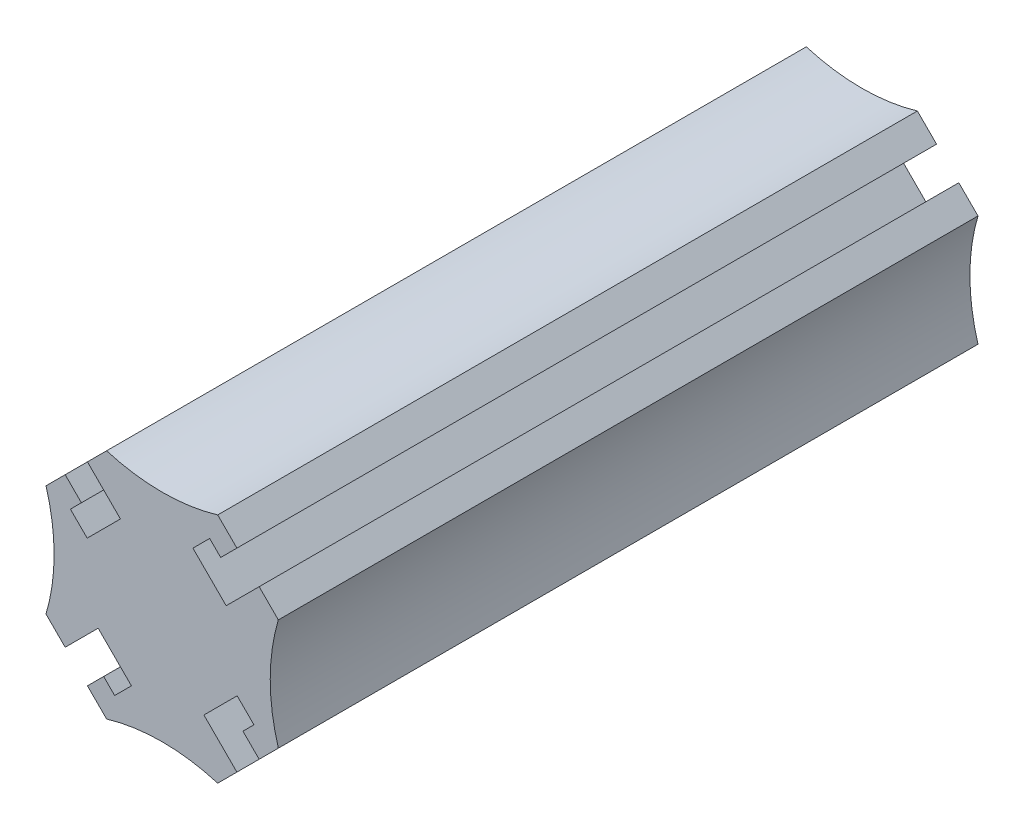
ISO-10303-21;
HEADER;
FILE_DESCRIPTION(('STEP AP214'),'2;1');
FILE_NAME('part.step','',(''),(''),'','','');
FILE_SCHEMA(('AUTOMOTIVE_DESIGN { 1 0 10303 214 1 1 1 1 }'));
ENDSEC;
DATA;
#1=APPLICATION_CONTEXT('core data for automotive mechanical design processes');
#2=APPLICATION_PROTOCOL_DEFINITION('international standard','automotive_design',2000,#1);
#3=PRODUCT_CONTEXT('',#1,'mechanical');
#4=PRODUCT('Part','Part','',(#3));
#5=PRODUCT_RELATED_PRODUCT_CATEGORY('part','',(#4));
#6=PRODUCT_DEFINITION_FORMATION('','',#4);
#7=PRODUCT_DEFINITION_CONTEXT('part definition',#1,'design');
#8=PRODUCT_DEFINITION('design','',#6,#7);
#9=PRODUCT_DEFINITION_SHAPE('','',#8);
#10=(LENGTH_UNIT() NAMED_UNIT(*) SI_UNIT(.MILLI.,.METRE.));
#11=(NAMED_UNIT(*) PLANE_ANGLE_UNIT() SI_UNIT($,.RADIAN.));
#12=(NAMED_UNIT(*) SI_UNIT($,.STERADIAN.) SOLID_ANGLE_UNIT());
#13=UNCERTAINTY_MEASURE_WITH_UNIT(LENGTH_MEASURE(1.E-05),#10,'distance_accuracy_value','');
#14=(GEOMETRIC_REPRESENTATION_CONTEXT(3) GLOBAL_UNCERTAINTY_ASSIGNED_CONTEXT((#13)) GLOBAL_UNIT_ASSIGNED_CONTEXT((#10,
#11,#12)) REPRESENTATION_CONTEXT('',''));
#15=CARTESIAN_POINT('',(0.,0.,0.));
#16=DIRECTION('',(0.,0.,1.));
#17=DIRECTION('',(1.,0.,0.));
#18=AXIS2_PLACEMENT_3D('',#15,#16,#17);
#19=CARTESIAN_POINT('',(0.,77.8,-180.));
#20=DIRECTION('',(0.,0.,1.));
#21=DIRECTION('',(1.,0.,0.));
#22=AXIS2_PLACEMENT_3D('',#19,#20,#21);
#23=CYLINDRICAL_SURFACE('',#22,50.);
#24=DIRECTION('',(0.,0.,1.));
#25=VECTOR('',#24,1.);
#26=CARTESIAN_POINT('',(-14.2914515142653,29.8859685100971,-180.));
#27=LINE('',#26,#25);
#28=CARTESIAN_POINT('',(-14.2914515142653,29.8859685100971,0.));
#29=VERTEX_POINT('',#28);
#30=CARTESIAN_POINT('',(-14.2914515142653,29.8859685100971,-180.));
#31=VERTEX_POINT('',#30);
#32=EDGE_CURVE('E278',#29,#31,#27,.F.);
#33=ORIENTED_EDGE('',*,*,#32,.F.);
#34=CARTESIAN_POINT('',(0.,77.8,0.));
#35=DIRECTION('',(0.,0.,-1.));
#36=DIRECTION('',(1.,0.,0.));
#37=AXIS2_PLACEMENT_3D('',#34,#35,#36);
#38=CIRCLE('',#37,50.);
#39=CARTESIAN_POINT('',(14.2914515142655,29.8859685100972,0.));
#40=VERTEX_POINT('',#39);
#41=EDGE_CURVE('E413',#40,#29,#38,.T.);
#42=ORIENTED_EDGE('',*,*,#41,.F.);
#43=DIRECTION('',(0.,0.,1.));
#44=VECTOR('',#43,1.);
#45=CARTESIAN_POINT('',(14.2914515142655,29.8859685100972,-180.));
#46=LINE('',#45,#44);
#47=CARTESIAN_POINT('',(14.2914515142655,29.8859685100972,-180.));
#48=VERTEX_POINT('',#47);
#49=EDGE_CURVE('E373',#48,#40,#46,.T.);
#50=ORIENTED_EDGE('',*,*,#49,.F.);
#51=CARTESIAN_POINT('',(0.,77.8,-180.));
#52=DIRECTION('',(0.,0.,-1.));
#53=DIRECTION('',(1.,0.,0.));
#54=AXIS2_PLACEMENT_3D('',#51,#52,#53);
#55=CIRCLE('',#54,50.);
#56=EDGE_CURVE('E414',#48,#31,#55,.T.);
#57=ORIENTED_EDGE('',*,*,#56,.T.);
#58=EDGE_LOOP('',(#33,#42,#50,#57));
#59=FACE_BOUND('',#58,.T.);
#60=ADVANCED_FACE('F36',(#59),#23,.F.);
#61=CARTESIAN_POINT('',(77.8,0.,-180.));
#62=DIRECTION('',(0.,0.,1.));
#63=DIRECTION('',(1.,0.,0.));
#64=AXIS2_PLACEMENT_3D('',#61,#62,#63);
#65=CYLINDRICAL_SURFACE('',#64,50.);
#66=DIRECTION('',(0.,0.,1.));
#67=VECTOR('',#66,1.);
#68=CARTESIAN_POINT('',(29.8859685100971,-14.2914515142653,-180.));
#69=LINE('',#68,#67);
#70=CARTESIAN_POINT('',(29.8859685100971,-14.2914515142653,-180.));
#71=VERTEX_POINT('',#70);
#72=CARTESIAN_POINT('',(29.8859685100971,-14.2914515142653,0.));
#73=VERTEX_POINT('',#72);
#74=EDGE_CURVE('E329',#71,#73,#69,.T.);
#75=ORIENTED_EDGE('',*,*,#74,.F.);
#76=CARTESIAN_POINT('',(77.8,0.,-180.));
#77=DIRECTION('',(0.,0.,-1.));
#78=DIRECTION('',(1.,0.,0.));
#79=AXIS2_PLACEMENT_3D('',#76,#77,#78);
#80=CIRCLE('',#79,50.);
#81=CARTESIAN_POINT('',(29.8859685100971,14.2914515142653,-180.));
#82=VERTEX_POINT('',#81);
#83=EDGE_CURVE('E421',#71,#82,#80,.T.);
#84=ORIENTED_EDGE('',*,*,#83,.T.);
#85=DIRECTION('',(0.,0.,1.));
#86=VECTOR('',#85,1.);
#87=CARTESIAN_POINT('',(29.8859685100971,14.2914515142653,-180.));
#88=LINE('',#87,#86);
#89=CARTESIAN_POINT('',(29.8859685100971,14.2914515142653,0.));
#90=VERTEX_POINT('',#89);
#91=EDGE_CURVE('E407',#90,#82,#88,.F.);
#92=ORIENTED_EDGE('',*,*,#91,.F.);
#93=CARTESIAN_POINT('',(77.8,0.,0.));
#94=DIRECTION('',(0.,0.,-1.));
#95=DIRECTION('',(1.,0.,0.));
#96=AXIS2_PLACEMENT_3D('',#93,#94,#95);
#97=CIRCLE('',#96,50.);
#98=EDGE_CURVE('E417',#73,#90,#97,.T.);
#99=ORIENTED_EDGE('',*,*,#98,.F.);
#100=EDGE_LOOP('',(#75,#84,#92,#99));
#101=FACE_BOUND('',#100,.T.);
#102=ADVANCED_FACE('F532',(#101),#65,.F.);
#103=CARTESIAN_POINT('',(0.,-77.8,-180.));
#104=DIRECTION('',(0.,0.,1.));
#105=DIRECTION('',(1.,0.,0.));
#106=AXIS2_PLACEMENT_3D('',#103,#104,#105);
#107=CYLINDRICAL_SURFACE('',#106,50.);
#108=DIRECTION('',(0.,0.,1.));
#109=VECTOR('',#108,1.);
#110=CARTESIAN_POINT('',(-14.2914515142653,-29.8859685100971,-180.));
#111=LINE('',#110,#109);
#112=CARTESIAN_POINT('',(-14.2914515142653,-29.8859685100971,-180.));
#113=VERTEX_POINT('',#112);
#114=CARTESIAN_POINT('',(-14.2914515142653,-29.8859685100971,0.));
#115=VERTEX_POINT('',#114);
#116=EDGE_CURVE('E58',#113,#115,#111,.T.);
#117=ORIENTED_EDGE('',*,*,#116,.F.);
#118=CARTESIAN_POINT('',(0.,-77.8,-180.));
#119=DIRECTION('',(0.,0.,-1.));
#120=DIRECTION('',(-1.,0.,0.));
#121=AXIS2_PLACEMENT_3D('',#118,#119,#120);
#122=CIRCLE('',#121,50.);
#123=CARTESIAN_POINT('',(14.2914515142654,-29.8859685100972,-180.));
#124=VERTEX_POINT('',#123);
#125=EDGE_CURVE('E419',#113,#124,#122,.T.);
#126=ORIENTED_EDGE('',*,*,#125,.T.);
#127=DIRECTION('',(0.,0.,1.));
#128=VECTOR('',#127,1.);
#129=CARTESIAN_POINT('',(14.2914515142654,-29.8859685100972,-180.));
#130=LINE('',#129,#128);
#131=CARTESIAN_POINT('',(14.2914515142654,-29.8859685100972,0.));
#132=VERTEX_POINT('',#131);
#133=EDGE_CURVE('E363',#132,#124,#130,.F.);
#134=ORIENTED_EDGE('',*,*,#133,.F.);
#135=CARTESIAN_POINT('',(0.,-77.8,0.));
#136=DIRECTION('',(0.,0.,-1.));
#137=DIRECTION('',(-1.,0.,0.));
#138=AXIS2_PLACEMENT_3D('',#135,#136,#137);
#139=CIRCLE('',#138,50.);
#140=EDGE_CURVE('E428',#115,#132,#139,.T.);
#141=ORIENTED_EDGE('',*,*,#140,.F.);
#142=EDGE_LOOP('',(#117,#126,#134,#141));
#143=FACE_BOUND('',#142,.T.);
#144=ADVANCED_FACE('F536',(#143),#107,.F.);
#145=CARTESIAN_POINT('',(-77.8,0.,-180.));
#146=DIRECTION('',(0.,0.,1.));
#147=DIRECTION('',(1.,0.,0.));
#148=AXIS2_PLACEMENT_3D('',#145,#146,#147);
#149=CYLINDRICAL_SURFACE('',#148,50.);
#150=DIRECTION('',(0.,0.,1.));
#151=VECTOR('',#150,1.);
#152=CARTESIAN_POINT('',(-29.8859685100972,14.2914515142655,-180.));
#153=LINE('',#152,#151);
#154=CARTESIAN_POINT('',(-29.8859685100972,14.2914515142655,-180.));
#155=VERTEX_POINT('',#154);
#156=CARTESIAN_POINT('',(-29.8859685100972,14.2914515142655,0.));
#157=VERTEX_POINT('',#156);
#158=EDGE_CURVE('E50',#155,#157,#153,.T.);
#159=ORIENTED_EDGE('',*,*,#158,.F.);
#160=CARTESIAN_POINT('',(-77.8,0.,-180.));
#161=DIRECTION('',(0.,0.,-1.));
#162=DIRECTION('',(-1.,0.,0.));
#163=AXIS2_PLACEMENT_3D('',#160,#161,#162);
#164=CIRCLE('',#163,50.);
#165=CARTESIAN_POINT('',(-29.8859685100972,-14.2914515142654,-180.));
#166=VERTEX_POINT('',#165);
#167=EDGE_CURVE('E264',#155,#166,#164,.T.);
#168=ORIENTED_EDGE('',*,*,#167,.T.);
#169=DIRECTION('',(0.,0.,1.));
#170=VECTOR('',#169,1.);
#171=CARTESIAN_POINT('',(-29.8859685100972,-14.2914515142654,-180.));
#172=LINE('',#171,#170);
#173=CARTESIAN_POINT('',(-29.8859685100971,-14.2914515142654,0.));
#174=VERTEX_POINT('',#173);
#175=EDGE_CURVE('E320',#174,#166,#172,.F.);
#176=ORIENTED_EDGE('',*,*,#175,.F.);
#177=CARTESIAN_POINT('',(-77.8,0.,0.));
#178=DIRECTION('',(0.,0.,-1.));
#179=DIRECTION('',(-1.,0.,0.));
#180=AXIS2_PLACEMENT_3D('',#177,#178,#179);
#181=CIRCLE('',#180,50.);
#182=EDGE_CURVE('E426',#157,#174,#181,.T.);
#183=ORIENTED_EDGE('',*,*,#182,.F.);
#184=EDGE_LOOP('',(#159,#168,#176,#183));
#185=FACE_BOUND('',#184,.T.);
#186=ADVANCED_FACE('F542',(#185),#149,.F.);
#187=CARTESIAN_POINT('',(0.,77.8,-180.));
#188=DIRECTION('',(0.,0.,1.));
#189=DIRECTION('',(1.,0.,0.));
#190=AXIS2_PLACEMENT_3D('',#187,#188,#189);
#191=PLANE('',#190);
#192=DIRECTION('',(-0.707106781186541,0.707106781186554,0.));
#193=VECTOR('',#192,1.);
#194=CARTESIAN_POINT('',(-36.0362175361947,41.763782463806,-180.));
#195=LINE('',#194,#193);
#196=CARTESIAN_POINT('',(-10.7396461741372,16.4672111017481,-180.));
#197=VERTEX_POINT('',#196);
#198=CARTESIAN_POINT('',(-19.2249275483757,24.9524924759867,-180.));
#199=VERTEX_POINT('',#198);
#200=EDGE_CURVE('E276',#197,#199,#195,.T.);
#201=ORIENTED_EDGE('',*,*,#200,.T.);
#202=DIRECTION('',(0.707106781186548,0.707106781186548,0.));
#203=VECTOR('',#202,1.);
#204=CARTESIAN_POINT('',(16.8112899878188,60.9887100121812,-180.));
#205=LINE('',#204,#203);
#206=EDGE_CURVE('E280',#199,#31,#205,.T.);
#207=ORIENTED_EDGE('',*,*,#206,.T.);
#208=ORIENTED_EDGE('',*,*,#56,.F.);
#209=DIRECTION('',(0.707106781186538,-0.707106781186558,0.));
#210=VECTOR('',#209,1.);
#211=CARTESIAN_POINT('',(-16.8112899878184,60.988710012182,-180.));
#212=LINE('',#211,#210);
#213=CARTESIAN_POINT('',(19.2249275483758,24.9524924759868,-180.));
#214=VERTEX_POINT('',#213);
#215=EDGE_CURVE('E389',#48,#214,#212,.T.);
#216=ORIENTED_EDGE('',*,*,#215,.T.);
#217=DIRECTION('',(-0.707106781186554,-0.707106781186541,0.));
#218=VECTOR('',#217,1.);
#219=CARTESIAN_POINT('',(36.0362175361943,41.7637824638051,-180.));
#220=LINE('',#219,#218);
#221=CARTESIAN_POINT('',(15.0529975393751,20.7805624669862,-180.));
#222=VERTEX_POINT('',#221);
#223=EDGE_CURVE('E392',#214,#222,#220,.T.);
#224=ORIENTED_EDGE('',*,*,#223,.T.);
#225=DIRECTION('',(-0.707106781186542,0.707106781186553,0.));
#226=VECTOR('',#225,1.);
#227=CARTESIAN_POINT('',(-20.9832199968192,56.8167800031811,-180.));
#228=LINE('',#227,#226);
#229=CARTESIAN_POINT('',(12.2245704146289,23.6089895917324,-180.));
#230=VERTEX_POINT('',#229);
#231=EDGE_CURVE('E395',#222,#230,#228,.T.);
#232=ORIENTED_EDGE('',*,*,#231,.T.);
#233=DIRECTION('',(-0.707106781186554,-0.707106781186541,0.));
#234=VECTOR('',#233,1.);
#235=CARTESIAN_POINT('',(33.2077904114481,44.5922095885513,-180.));
#236=LINE('',#235,#234);
#237=CARTESIAN_POINT('',(7.91121904939095,19.2956382264945,-180.));
#238=VERTEX_POINT('',#237);
#239=EDGE_CURVE('E398',#230,#238,#236,.T.);
#240=ORIENTED_EDGE('',*,*,#239,.T.);
#241=DIRECTION('',(0.707106781186542,-0.707106781186554,0.));
#242=VECTOR('',#241,1.);
#243=CARTESIAN_POINT('',(-25.2965713620572,52.5034286379432,-180.));
#244=LINE('',#243,#242);
#245=CARTESIAN_POINT('',(16.4672111017481,10.7396461741372,-180.));
#246=VERTEX_POINT('',#245);
#247=EDGE_CURVE('E401',#238,#246,#244,.T.);
#248=ORIENTED_EDGE('',*,*,#247,.T.);
#249=DIRECTION('',(0.707106781186554,0.707106781186541,0.));
#250=VECTOR('',#249,1.);
#251=CARTESIAN_POINT('',(41.7637824638053,36.036217536194,-180.));
#252=LINE('',#251,#250);
#253=CARTESIAN_POINT('',(24.9524924759867,19.2249275483757,-180.));
#254=VERTEX_POINT('',#253);
#255=EDGE_CURVE('E404',#246,#254,#252,.T.);
#256=ORIENTED_EDGE('',*,*,#255,.T.);
#257=DIRECTION('',(0.707106781186547,-0.707106781186548,0.));
#258=VECTOR('',#257,1.);
#259=CARTESIAN_POINT('',(-16.8112899878188,60.9887100121812,-180.));
#260=LINE('',#259,#258);
#261=EDGE_CURVE('E410',#254,#82,#260,.T.);
#262=ORIENTED_EDGE('',*,*,#261,.T.);
#263=ORIENTED_EDGE('',*,*,#83,.F.);
#264=DIRECTION('',(-0.707106781186546,-0.707106781186549,0.));
#265=VECTOR('',#264,1.);
#266=CARTESIAN_POINT('',(60.9887100121813,16.811289987819,-180.));
#267=LINE('',#266,#265);
#268=CARTESIAN_POINT('',(24.9524924759867,-19.2249275483757,-180.));
#269=VERTEX_POINT('',#268);
#270=EDGE_CURVE('E345',#71,#269,#267,.T.);
#271=ORIENTED_EDGE('',*,*,#270,.T.);
#272=DIRECTION('',(-0.707106781186551,0.707106781186544,0.));
#273=VECTOR('',#272,1.);
#274=CARTESIAN_POINT('',(-36.0362175361946,41.763782463805,-180.));
#275=LINE('',#274,#273);
#276=CARTESIAN_POINT('',(20.7805624669861,-15.0529975393751,-180.));
#277=VERTEX_POINT('',#276);
#278=EDGE_CURVE('E348',#269,#277,#275,.T.);
#279=ORIENTED_EDGE('',*,*,#278,.T.);
#280=DIRECTION('',(0.707106781186544,0.707106781186551,0.));
#281=VECTOR('',#280,1.);
#282=CARTESIAN_POINT('',(56.8167800031807,20.9832199968199,-180.));
#283=LINE('',#282,#281);
#284=CARTESIAN_POINT('',(23.6089895917323,-12.2245704146289,-180.));
#285=VERTEX_POINT('',#284);
#286=EDGE_CURVE('E351',#277,#285,#283,.T.);
#287=ORIENTED_EDGE('',*,*,#286,.T.);
#288=DIRECTION('',(-0.707106781186551,0.707106781186544,0.));
#289=VECTOR('',#288,1.);
#290=CARTESIAN_POINT('',(-33.2077904114484,44.5922095885512,-180.));
#291=LINE('',#290,#289);
#292=CARTESIAN_POINT('',(19.2956382264943,-7.91121904939094,-180.));
#293=VERTEX_POINT('',#292);
#294=EDGE_CURVE('E354',#285,#293,#291,.T.);
#295=ORIENTED_EDGE('',*,*,#294,.T.);
#296=DIRECTION('',(-0.707106781186544,-0.707106781186551,0.));
#297=VECTOR('',#296,1.);
#298=CARTESIAN_POINT('',(52.5034286379427,25.2965713620578,-180.));
#299=LINE('',#298,#297);
#300=CARTESIAN_POINT('',(10.7396461741371,-16.4672111017482,-180.));
#301=VERTEX_POINT('',#300);
#302=EDGE_CURVE('E357',#293,#301,#299,.T.);
#303=ORIENTED_EDGE('',*,*,#302,.T.);
#304=DIRECTION('',(0.707106781186551,-0.707106781186544,0.));
#305=VECTOR('',#304,1.);
#306=CARTESIAN_POINT('',(-41.7637824638056,36.036217536194,-180.));
#307=LINE('',#306,#305);
#308=CARTESIAN_POINT('',(19.2249275483757,-24.9524924759867,-180.));
#309=VERTEX_POINT('',#308);
#310=EDGE_CURVE('E360',#301,#309,#307,.T.);
#311=ORIENTED_EDGE('',*,*,#310,.T.);
#312=DIRECTION('',(-0.70710678118654,-0.707106781186555,0.));
#313=VECTOR('',#312,1.);
#314=CARTESIAN_POINT('',(60.9887100121814,16.8112899878198,-180.));
#315=LINE('',#314,#313);
#316=EDGE_CURVE('E366',#309,#124,#315,.T.);
#317=ORIENTED_EDGE('',*,*,#316,.T.);
#318=ORIENTED_EDGE('',*,*,#125,.F.);
#319=DIRECTION('',(-0.707106781186548,0.707106781186547,0.));
#320=VECTOR('',#319,1.);
#321=CARTESIAN_POINT('',(-60.9887100121812,16.8112899878187,-180.));
#322=LINE('',#321,#320);
#323=CARTESIAN_POINT('',(-19.2249275483757,-24.9524924759867,-180.));
#324=VERTEX_POINT('',#323);
#325=EDGE_CURVE('E302',#113,#324,#322,.T.);
#326=ORIENTED_EDGE('',*,*,#325,.T.);
#327=DIRECTION('',(0.707106781186545,0.70710678118655,0.));
#328=VECTOR('',#327,1.);
#329=CARTESIAN_POINT('',(41.7637824638054,36.0362175361949,-180.));
#330=LINE('',#329,#328);
#331=CARTESIAN_POINT('',(-15.0529975393751,-20.7805624669861,-180.));
#332=VERTEX_POINT('',#331);
#333=EDGE_CURVE('E305',#324,#332,#330,.T.);
#334=ORIENTED_EDGE('',*,*,#333,.T.);
#335=DIRECTION('',(0.70710678118655,-0.707106781186545,0.));
#336=VECTOR('',#335,1.);
#337=CARTESIAN_POINT('',(-56.8167800031805,20.983219996819,-180.));
#338=LINE('',#337,#336);
#339=CARTESIAN_POINT('',(-12.2245704146289,-23.6089895917323,-180.));
#340=VERTEX_POINT('',#339);
#341=EDGE_CURVE('E308',#332,#340,#338,.T.);
#342=ORIENTED_EDGE('',*,*,#341,.T.);
#343=DIRECTION('',(0.707106781186545,0.70710678118655,0.));
#344=VECTOR('',#343,1.);
#345=CARTESIAN_POINT('',(44.5922095885517,33.2077904114487,-180.));
#346=LINE('',#345,#344);
#347=CARTESIAN_POINT('',(-7.91121904939094,-19.2956382264943,-180.));
#348=VERTEX_POINT('',#347);
#349=EDGE_CURVE('E311',#340,#348,#346,.T.);
#350=ORIENTED_EDGE('',*,*,#349,.T.);
#351=DIRECTION('',(-0.70710678118655,0.707106781186545,0.));
#352=VECTOR('',#351,1.);
#353=CARTESIAN_POINT('',(-52.5034286379426,25.296571362057,-180.));
#354=LINE('',#353,#352);
#355=CARTESIAN_POINT('',(-16.4672111017482,-10.7396461741371,-180.));
#356=VERTEX_POINT('',#355);
#357=EDGE_CURVE('E314',#348,#356,#354,.T.);
#358=ORIENTED_EDGE('',*,*,#357,.T.);
#359=DIRECTION('',(-0.707106781186545,-0.70710678118655,0.));
#360=VECTOR('',#359,1.);
#361=CARTESIAN_POINT('',(36.0362175361944,41.7637824638059,-180.));
#362=LINE('',#361,#360);
#363=CARTESIAN_POINT('',(-24.9524924759867,-19.2249275483757,-180.));
#364=VERTEX_POINT('',#363);
#365=EDGE_CURVE('E317',#356,#364,#362,.T.);
#366=ORIENTED_EDGE('',*,*,#365,.T.);
#367=DIRECTION('',(-0.707106781186554,0.707106781186541,0.));
#368=VECTOR('',#367,1.);
#369=CARTESIAN_POINT('',(-60.988710012181,16.8112899878178,-180.));
#370=LINE('',#369,#368);
#371=EDGE_CURVE('E323',#364,#166,#370,.T.);
#372=ORIENTED_EDGE('',*,*,#371,.T.);
#373=ORIENTED_EDGE('',*,*,#167,.F.);
#374=DIRECTION('',(0.707106781186557,0.707106781186538,0.));
#375=VECTOR('',#374,1.);
#376=CARTESIAN_POINT('',(16.8112899878191,60.9887100121805,-180.));
#377=LINE('',#376,#375);
#378=CARTESIAN_POINT('',(-24.9524924759868,19.2249275483758,-180.));
#379=VERTEX_POINT('',#378);
#380=EDGE_CURVE('E255',#155,#379,#377,.T.);
#381=ORIENTED_EDGE('',*,*,#380,.T.);
#382=DIRECTION('',(0.707106781186541,-0.707106781186554,0.));
#383=VECTOR('',#382,1.);
#384=CARTESIAN_POINT('',(-41.7637824638057,36.036217536195,-180.));
#385=LINE('',#384,#383);
#386=CARTESIAN_POINT('',(-20.7805624669862,15.0529975393751,-180.));
#387=VERTEX_POINT('',#386);
#388=EDGE_CURVE('E244',#379,#387,#385,.T.);
#389=ORIENTED_EDGE('',*,*,#388,.T.);
#390=DIRECTION('',(-0.707106781186553,-0.707106781186542,0.));
#391=VECTOR('',#390,1.);
#392=CARTESIAN_POINT('',(20.9832199968195,56.8167800031802,-180.));
#393=LINE('',#392,#391);
#394=CARTESIAN_POINT('',(-23.6089895917324,12.2245704146289,-180.));
#395=VERTEX_POINT('',#394);
#396=EDGE_CURVE('E254',#387,#395,#393,.T.);
#397=ORIENTED_EDGE('',*,*,#396,.T.);
#398=DIRECTION('',(0.707106781186541,-0.707106781186554,0.));
#399=VECTOR('',#398,1.);
#400=CARTESIAN_POINT('',(-44.592209588552,33.2077904114488,-180.));
#401=LINE('',#400,#399);
#402=CARTESIAN_POINT('',(-19.2956382264945,7.91121904939095,-180.));
#403=VERTEX_POINT('',#402);
#404=EDGE_CURVE('E270',#395,#403,#401,.T.);
#405=ORIENTED_EDGE('',*,*,#404,.T.);
#406=DIRECTION('',(0.707106781186553,0.707106781186542,0.));
#407=VECTOR('',#406,1.);
#408=CARTESIAN_POINT('',(25.2965713620574,52.5034286379422,-180.));
#409=LINE('',#408,#407);
#410=EDGE_CURVE('E273',#403,#197,#409,.T.);
#411=ORIENTED_EDGE('',*,*,#410,.T.);
#412=EDGE_LOOP('',(#201,#207,#208,#216,#224,#232,#240,#248,#256,#262,#263,#271,#279,#287,#295,
#303,#311,#317,#318,#326,#334,#342,#350,#358,#366,#372,#373,#381,#389,#397,#405,#411));
#413=FACE_BOUND('',#412,.T.);
#414=ADVANCED_FACE('F262',(#413),#191,.F.);
#415=CARTESIAN_POINT('',(0.,77.8,0.));
#416=DIRECTION('',(0.,0.,1.));
#417=DIRECTION('',(1.,0.,0.));
#418=AXIS2_PLACEMENT_3D('',#415,#416,#417);
#419=PLANE('',#418);
#420=DIRECTION('',(0.707106781186548,0.707106781186548,0.));
#421=VECTOR('',#420,1.);
#422=CARTESIAN_POINT('',(16.8112899878188,60.9887100121812,0.));
#423=LINE('',#422,#421);
#424=CARTESIAN_POINT('',(-19.2249275483757,24.9524924759867,0.));
#425=VERTEX_POINT('',#424);
#426=EDGE_CURVE('E11',#425,#29,#423,.T.);
#427=ORIENTED_EDGE('',*,*,#426,.F.);
#428=DIRECTION('',(-0.707106781186541,0.707106781186554,0.));
#429=VECTOR('',#428,1.);
#430=CARTESIAN_POINT('',(-36.0362175361947,41.763782463806,0.));
#431=LINE('',#430,#429);
#432=CARTESIAN_POINT('',(-10.7396461741372,16.4672111017481,0.));
#433=VERTEX_POINT('',#432);
#434=EDGE_CURVE('E43',#433,#425,#431,.T.);
#435=ORIENTED_EDGE('',*,*,#434,.F.);
#436=DIRECTION('',(0.707106781186553,0.707106781186542,0.));
#437=VECTOR('',#436,1.);
#438=CARTESIAN_POINT('',(25.2965713620574,52.5034286379422,0.));
#439=LINE('',#438,#437);
#440=CARTESIAN_POINT('',(-19.2956382264945,7.91121904939095,0.));
#441=VERTEX_POINT('',#440);
#442=EDGE_CURVE('E482',#441,#433,#439,.T.);
#443=ORIENTED_EDGE('',*,*,#442,.F.);
#444=DIRECTION('',(0.707106781186541,-0.707106781186554,0.));
#445=VECTOR('',#444,1.);
#446=CARTESIAN_POINT('',(-44.592209588552,33.2077904114488,0.));
#447=LINE('',#446,#445);
#448=CARTESIAN_POINT('',(-23.6089895917324,12.2245704146289,0.));
#449=VERTEX_POINT('',#448);
#450=EDGE_CURVE('E480',#449,#441,#447,.T.);
#451=ORIENTED_EDGE('',*,*,#450,.F.);
#452=DIRECTION('',(-0.707106781186553,-0.707106781186542,0.));
#453=VECTOR('',#452,1.);
#454=CARTESIAN_POINT('',(20.9832199968195,56.8167800031802,0.));
#455=LINE('',#454,#453);
#456=CARTESIAN_POINT('',(-20.7805624669862,15.0529975393751,0.));
#457=VERTEX_POINT('',#456);
#458=EDGE_CURVE('E478',#457,#449,#455,.T.);
#459=ORIENTED_EDGE('',*,*,#458,.F.);
#460=DIRECTION('',(0.707106781186541,-0.707106781186554,0.));
#461=VECTOR('',#460,1.);
#462=CARTESIAN_POINT('',(-41.7637824638057,36.036217536195,0.));
#463=LINE('',#462,#461);
#464=CARTESIAN_POINT('',(-24.9524924759868,19.2249275483758,0.));
#465=VERTEX_POINT('',#464);
#466=EDGE_CURVE('E476',#465,#457,#463,.T.);
#467=ORIENTED_EDGE('',*,*,#466,.F.);
#468=DIRECTION('',(0.707106781186557,0.707106781186538,0.));
#469=VECTOR('',#468,1.);
#470=CARTESIAN_POINT('',(16.8112899878191,60.9887100121805,0.));
#471=LINE('',#470,#469);
#472=EDGE_CURVE('E258',#157,#465,#471,.T.);
#473=ORIENTED_EDGE('',*,*,#472,.F.);
#474=ORIENTED_EDGE('',*,*,#182,.T.);
#475=DIRECTION('',(-0.707106781186554,0.707106781186541,0.));
#476=VECTOR('',#475,1.);
#477=CARTESIAN_POINT('',(-60.988710012181,16.8112899878178,0.));
#478=LINE('',#477,#476);
#479=CARTESIAN_POINT('',(-24.9524924759867,-19.2249275483757,0.));
#480=VERTEX_POINT('',#479);
#481=EDGE_CURVE('E472',#480,#174,#478,.T.);
#482=ORIENTED_EDGE('',*,*,#481,.F.);
#483=DIRECTION('',(-0.707106781186545,-0.70710678118655,0.));
#484=VECTOR('',#483,1.);
#485=CARTESIAN_POINT('',(36.0362175361944,41.7637824638059,0.));
#486=LINE('',#485,#484);
#487=CARTESIAN_POINT('',(-16.4672111017482,-10.7396461741371,0.));
#488=VERTEX_POINT('',#487);
#489=EDGE_CURVE('E470',#488,#480,#486,.T.);
#490=ORIENTED_EDGE('',*,*,#489,.F.);
#491=DIRECTION('',(-0.70710678118655,0.707106781186545,0.));
#492=VECTOR('',#491,1.);
#493=CARTESIAN_POINT('',(-52.5034286379426,25.296571362057,0.));
#494=LINE('',#493,#492);
#495=CARTESIAN_POINT('',(-7.91121904939094,-19.2956382264943,0.));
#496=VERTEX_POINT('',#495);
#497=EDGE_CURVE('E468',#496,#488,#494,.T.);
#498=ORIENTED_EDGE('',*,*,#497,.F.);
#499=DIRECTION('',(0.707106781186545,0.70710678118655,0.));
#500=VECTOR('',#499,1.);
#501=CARTESIAN_POINT('',(44.5922095885517,33.2077904114487,0.));
#502=LINE('',#501,#500);
#503=CARTESIAN_POINT('',(-12.2245704146289,-23.6089895917323,0.));
#504=VERTEX_POINT('',#503);
#505=EDGE_CURVE('E466',#504,#496,#502,.T.);
#506=ORIENTED_EDGE('',*,*,#505,.F.);
#507=DIRECTION('',(0.70710678118655,-0.707106781186545,0.));
#508=VECTOR('',#507,1.);
#509=CARTESIAN_POINT('',(-56.8167800031805,20.983219996819,0.));
#510=LINE('',#509,#508);
#511=CARTESIAN_POINT('',(-15.0529975393751,-20.7805624669861,0.));
#512=VERTEX_POINT('',#511);
#513=EDGE_CURVE('E464',#512,#504,#510,.T.);
#514=ORIENTED_EDGE('',*,*,#513,.F.);
#515=DIRECTION('',(0.707106781186545,0.70710678118655,0.));
#516=VECTOR('',#515,1.);
#517=CARTESIAN_POINT('',(41.7637824638054,36.0362175361949,0.));
#518=LINE('',#517,#516);
#519=CARTESIAN_POINT('',(-19.2249275483757,-24.9524924759867,0.));
#520=VERTEX_POINT('',#519);
#521=EDGE_CURVE('E462',#520,#512,#518,.T.);
#522=ORIENTED_EDGE('',*,*,#521,.F.);
#523=DIRECTION('',(-0.707106781186548,0.707106781186547,0.));
#524=VECTOR('',#523,1.);
#525=CARTESIAN_POINT('',(-60.9887100121812,16.8112899878187,0.));
#526=LINE('',#525,#524);
#527=EDGE_CURVE('E460',#115,#520,#526,.T.);
#528=ORIENTED_EDGE('',*,*,#527,.F.);
#529=ORIENTED_EDGE('',*,*,#140,.T.);
#530=DIRECTION('',(-0.70710678118654,-0.707106781186555,0.));
#531=VECTOR('',#530,1.);
#532=CARTESIAN_POINT('',(60.9887100121814,16.8112899878198,0.));
#533=LINE('',#532,#531);
#534=CARTESIAN_POINT('',(19.2249275483757,-24.9524924759867,0.));
#535=VERTEX_POINT('',#534);
#536=EDGE_CURVE('E457',#535,#132,#533,.T.);
#537=ORIENTED_EDGE('',*,*,#536,.F.);
#538=DIRECTION('',(0.707106781186551,-0.707106781186544,0.));
#539=VECTOR('',#538,1.);
#540=CARTESIAN_POINT('',(-41.7637824638056,36.036217536194,0.));
#541=LINE('',#540,#539);
#542=CARTESIAN_POINT('',(10.7396461741371,-16.4672111017482,0.));
#543=VERTEX_POINT('',#542);
#544=EDGE_CURVE('E455',#543,#535,#541,.T.);
#545=ORIENTED_EDGE('',*,*,#544,.F.);
#546=DIRECTION('',(-0.707106781186544,-0.707106781186551,0.));
#547=VECTOR('',#546,1.);
#548=CARTESIAN_POINT('',(52.5034286379427,25.2965713620578,0.));
#549=LINE('',#548,#547);
#550=CARTESIAN_POINT('',(19.2956382264943,-7.91121904939094,0.));
#551=VERTEX_POINT('',#550);
#552=EDGE_CURVE('E453',#551,#543,#549,.T.);
#553=ORIENTED_EDGE('',*,*,#552,.F.);
#554=DIRECTION('',(-0.707106781186551,0.707106781186544,0.));
#555=VECTOR('',#554,1.);
#556=CARTESIAN_POINT('',(-33.2077904114484,44.5922095885512,0.));
#557=LINE('',#556,#555);
#558=CARTESIAN_POINT('',(23.6089895917323,-12.2245704146289,0.));
#559=VERTEX_POINT('',#558);
#560=EDGE_CURVE('E451',#559,#551,#557,.T.);
#561=ORIENTED_EDGE('',*,*,#560,.F.);
#562=DIRECTION('',(0.707106781186544,0.707106781186551,0.));
#563=VECTOR('',#562,1.);
#564=CARTESIAN_POINT('',(56.8167800031807,20.9832199968199,0.));
#565=LINE('',#564,#563);
#566=CARTESIAN_POINT('',(20.7805624669861,-15.0529975393751,0.));
#567=VERTEX_POINT('',#566);
#568=EDGE_CURVE('E449',#567,#559,#565,.T.);
#569=ORIENTED_EDGE('',*,*,#568,.F.);
#570=DIRECTION('',(-0.707106781186551,0.707106781186544,0.));
#571=VECTOR('',#570,1.);
#572=CARTESIAN_POINT('',(-36.0362175361946,41.763782463805,0.));
#573=LINE('',#572,#571);
#574=CARTESIAN_POINT('',(24.9524924759867,-19.2249275483757,0.));
#575=VERTEX_POINT('',#574);
#576=EDGE_CURVE('E447',#575,#567,#573,.T.);
#577=ORIENTED_EDGE('',*,*,#576,.F.);
#578=DIRECTION('',(-0.707106781186546,-0.707106781186549,0.));
#579=VECTOR('',#578,1.);
#580=CARTESIAN_POINT('',(60.9887100121813,16.811289987819,0.));
#581=LINE('',#580,#579);
#582=EDGE_CURVE('E445',#73,#575,#581,.T.);
#583=ORIENTED_EDGE('',*,*,#582,.F.);
#584=ORIENTED_EDGE('',*,*,#98,.T.);
#585=DIRECTION('',(0.707106781186547,-0.707106781186548,0.));
#586=VECTOR('',#585,1.);
#587=CARTESIAN_POINT('',(-16.8112899878188,60.9887100121812,0.));
#588=LINE('',#587,#586);
#589=CARTESIAN_POINT('',(24.9524924759867,19.2249275483757,0.));
#590=VERTEX_POINT('',#589);
#591=EDGE_CURVE('E442',#590,#90,#588,.T.);
#592=ORIENTED_EDGE('',*,*,#591,.F.);
#593=DIRECTION('',(0.707106781186554,0.707106781186541,0.));
#594=VECTOR('',#593,1.);
#595=CARTESIAN_POINT('',(41.7637824638053,36.036217536194,0.));
#596=LINE('',#595,#594);
#597=CARTESIAN_POINT('',(16.4672111017481,10.7396461741372,0.));
#598=VERTEX_POINT('',#597);
#599=EDGE_CURVE('E440',#598,#590,#596,.T.);
#600=ORIENTED_EDGE('',*,*,#599,.F.);
#601=DIRECTION('',(0.707106781186542,-0.707106781186554,0.));
#602=VECTOR('',#601,1.);
#603=CARTESIAN_POINT('',(-25.2965713620572,52.5034286379432,0.));
#604=LINE('',#603,#602);
#605=CARTESIAN_POINT('',(7.91121904939095,19.2956382264945,0.));
#606=VERTEX_POINT('',#605);
#607=EDGE_CURVE('E438',#606,#598,#604,.T.);
#608=ORIENTED_EDGE('',*,*,#607,.F.);
#609=DIRECTION('',(-0.707106781186554,-0.707106781186541,0.));
#610=VECTOR('',#609,1.);
#611=CARTESIAN_POINT('',(33.2077904114481,44.5922095885513,0.));
#612=LINE('',#611,#610);
#613=CARTESIAN_POINT('',(12.2245704146289,23.6089895917324,0.));
#614=VERTEX_POINT('',#613);
#615=EDGE_CURVE('E436',#614,#606,#612,.T.);
#616=ORIENTED_EDGE('',*,*,#615,.F.);
#617=DIRECTION('',(-0.707106781186542,0.707106781186553,0.));
#618=VECTOR('',#617,1.);
#619=CARTESIAN_POINT('',(-20.9832199968192,56.8167800031811,0.));
#620=LINE('',#619,#618);
#621=CARTESIAN_POINT('',(15.0529975393751,20.7805624669862,0.));
#622=VERTEX_POINT('',#621);
#623=EDGE_CURVE('E434',#622,#614,#620,.T.);
#624=ORIENTED_EDGE('',*,*,#623,.F.);
#625=DIRECTION('',(-0.707106781186554,-0.707106781186541,0.));
#626=VECTOR('',#625,1.);
#627=CARTESIAN_POINT('',(36.0362175361943,41.7637824638051,0.));
#628=LINE('',#627,#626);
#629=CARTESIAN_POINT('',(19.2249275483758,24.9524924759868,0.));
#630=VERTEX_POINT('',#629);
#631=EDGE_CURVE('E432',#630,#622,#628,.T.);
#632=ORIENTED_EDGE('',*,*,#631,.F.);
#633=DIRECTION('',(0.707106781186538,-0.707106781186558,0.));
#634=VECTOR('',#633,1.);
#635=CARTESIAN_POINT('',(-16.8112899878184,60.988710012182,0.));
#636=LINE('',#635,#634);
#637=EDGE_CURVE('E423',#40,#630,#636,.T.);
#638=ORIENTED_EDGE('',*,*,#637,.F.);
#639=ORIENTED_EDGE('',*,*,#41,.T.);
#640=EDGE_LOOP('',(#427,#435,#443,#451,#459,#467,#473,#474,#482,#490,#498,#506,#514,#522,#528,
#529,#537,#545,#553,#561,#569,#577,#583,#584,#592,#600,#608,#616,#624,#632,#638,#639));
#641=FACE_BOUND('',#640,.T.);
#642=ADVANCED_FACE('F498',(#641),#419,.T.);
#643=CARTESIAN_POINT('',(24.9171371369274,19.260282887435,-180.));
#644=DIRECTION('',(-0.707106781186548,-0.707106781186547,0.));
#645=DIRECTION('',(0.707106781186547,-0.707106781186548,0.));
#646=AXIS2_PLACEMENT_3D('',#643,#644,#645);
#647=PLANE('',#646);
#648=DIRECTION('',(0.,0.,1.));
#649=VECTOR('',#648,1.);
#650=CARTESIAN_POINT('',(24.9524924759867,19.2249275483757,-180.));
#651=LINE('',#650,#649);
#652=EDGE_CURVE('E370',#254,#590,#651,.T.);
#653=ORIENTED_EDGE('',*,*,#652,.T.);
#654=ORIENTED_EDGE('',*,*,#591,.T.);
#655=ORIENTED_EDGE('',*,*,#91,.T.);
#656=ORIENTED_EDGE('',*,*,#261,.F.);
#657=EDGE_LOOP('',(#653,#654,#655,#656));
#658=FACE_BOUND('',#657,.T.);
#659=ADVANCED_FACE('F616',(#658),#647,.F.);
#660=CARTESIAN_POINT('',(24.9878478150461,19.260282887435,-180.));
#661=DIRECTION('',(0.707106781186541,-0.707106781186554,0.));
#662=DIRECTION('',(0.,0.,-1.));
#663=AXIS2_PLACEMENT_3D('',#660,#661,#662);
#664=PLANE('',#663);
#665=DIRECTION('',(0.,0.,1.));
#666=VECTOR('',#665,1.);
#667=CARTESIAN_POINT('',(16.4672111017481,10.7396461741372,-180.));
#668=LINE('',#667,#666);
#669=EDGE_CURVE('E374',#246,#598,#668,.T.);
#670=ORIENTED_EDGE('',*,*,#669,.T.);
#671=ORIENTED_EDGE('',*,*,#599,.T.);
#672=ORIENTED_EDGE('',*,*,#652,.F.);
#673=ORIENTED_EDGE('',*,*,#255,.F.);
#674=EDGE_LOOP('',(#670,#671,#672,#673));
#675=FACE_BOUND('',#674,.T.);
#676=ADVANCED_FACE('F619',(#675),#664,.F.);
#677=CARTESIAN_POINT('',(16.4318557626888,10.7750015131966,-180.));
#678=DIRECTION('',(-0.707106781186553,-0.707106781186541,0.));
#679=DIRECTION('',(0.707106781186542,-0.707106781186554,0.));
#680=AXIS2_PLACEMENT_3D('',#677,#678,#679);
#681=PLANE('',#680);
#682=DIRECTION('',(0.,0.,1.));
#683=VECTOR('',#682,1.);
#684=CARTESIAN_POINT('',(7.91121904939095,19.2956382264945,-180.));
#685=LINE('',#684,#683);
#686=EDGE_CURVE('E377',#238,#606,#685,.T.);
#687=ORIENTED_EDGE('',*,*,#686,.T.);
#688=ORIENTED_EDGE('',*,*,#607,.T.);
#689=ORIENTED_EDGE('',*,*,#669,.F.);
#690=ORIENTED_EDGE('',*,*,#247,.F.);
#691=EDGE_LOOP('',(#687,#688,#689,#690));
#692=FACE_BOUND('',#691,.T.);
#693=ADVANCED_FACE('F623',(#692),#681,.F.);
#694=CARTESIAN_POINT('',(7.94657438845028,19.3309935655539,-180.));
#695=DIRECTION('',(-0.707106781186541,0.707106781186554,0.));
#696=DIRECTION('',(0.,0.,1.));
#697=AXIS2_PLACEMENT_3D('',#694,#695,#696);
#698=PLANE('',#697);
#699=DIRECTION('',(0.,0.,1.));
#700=VECTOR('',#699,1.);
#701=CARTESIAN_POINT('',(12.2245704146289,23.6089895917324,-180.));
#702=LINE('',#701,#700);
#703=EDGE_CURVE('E380',#230,#614,#702,.T.);
#704=ORIENTED_EDGE('',*,*,#703,.T.);
#705=ORIENTED_EDGE('',*,*,#615,.T.);
#706=ORIENTED_EDGE('',*,*,#686,.F.);
#707=ORIENTED_EDGE('',*,*,#239,.F.);
#708=EDGE_LOOP('',(#704,#705,#706,#707));
#709=FACE_BOUND('',#708,.T.);
#710=ADVANCED_FACE('F626',(#709),#698,.F.);
#711=CARTESIAN_POINT('',(12.2599257536883,23.5736342526731,-180.));
#712=DIRECTION('',(0.707106781186553,0.707106781186542,0.));
#713=DIRECTION('',(-0.707106781186542,0.707106781186553,0.));
#714=AXIS2_PLACEMENT_3D('',#711,#712,#713);
#715=PLANE('',#714);
#716=DIRECTION('',(0.,0.,1.));
#717=VECTOR('',#716,1.);
#718=CARTESIAN_POINT('',(15.0529975393751,20.7805624669862,-180.));
#719=LINE('',#718,#717);
#720=EDGE_CURVE('E383',#222,#622,#719,.T.);
#721=ORIENTED_EDGE('',*,*,#720,.T.);
#722=ORIENTED_EDGE('',*,*,#623,.T.);
#723=ORIENTED_EDGE('',*,*,#703,.F.);
#724=ORIENTED_EDGE('',*,*,#231,.F.);
#725=EDGE_LOOP('',(#721,#722,#723,#724));
#726=FACE_BOUND('',#725,.T.);
#727=ADVANCED_FACE('F631',(#726),#715,.F.);
#728=CARTESIAN_POINT('',(15.0176422003158,20.7452071279269,-180.));
#729=DIRECTION('',(-0.707106781186541,0.707106781186554,0.));
#730=DIRECTION('',(0.,0.,1.));
#731=AXIS2_PLACEMENT_3D('',#728,#729,#730);
#732=PLANE('',#731);
#733=DIRECTION('',(0.,0.,1.));
#734=VECTOR('',#733,1.);
#735=CARTESIAN_POINT('',(19.2249275483758,24.9524924759868,-180.));
#736=LINE('',#735,#734);
#737=EDGE_CURVE('E369',#214,#630,#736,.T.);
#738=ORIENTED_EDGE('',*,*,#737,.T.);
#739=ORIENTED_EDGE('',*,*,#631,.T.);
#740=ORIENTED_EDGE('',*,*,#720,.F.);
#741=ORIENTED_EDGE('',*,*,#223,.F.);
#742=EDGE_LOOP('',(#738,#739,#740,#741));
#743=FACE_BOUND('',#742,.T.);
#744=ADVANCED_FACE('F634',(#743),#732,.F.);
#745=CARTESIAN_POINT('',(14.3105354191293,29.8668846052334,-180.));
#746=DIRECTION('',(-0.707106781186557,-0.707106781186537,0.));
#747=DIRECTION('',(0.707106781186538,-0.707106781186558,0.));
#748=AXIS2_PLACEMENT_3D('',#745,#746,#747);
#749=PLANE('',#748);
#750=ORIENTED_EDGE('',*,*,#49,.T.);
#751=ORIENTED_EDGE('',*,*,#637,.T.);
#752=ORIENTED_EDGE('',*,*,#737,.F.);
#753=ORIENTED_EDGE('',*,*,#215,.F.);
#754=EDGE_LOOP('',(#750,#751,#752,#753));
#755=FACE_BOUND('',#754,.T.);
#756=ADVANCED_FACE('F637',(#755),#749,.F.);
#757=CARTESIAN_POINT('',(14.3105354191293,-29.8668846052333,-180.));
#758=DIRECTION('',(-0.707106781186555,0.70710678118654,0.));
#759=DIRECTION('',(-0.70710678118654,-0.707106781186555,0.));
#760=AXIS2_PLACEMENT_3D('',#757,#758,#759);
#761=PLANE('',#760);
#762=DIRECTION('',(0.,0.,1.));
#763=VECTOR('',#762,1.);
#764=CARTESIAN_POINT('',(19.2249275483757,-24.9524924759867,-180.));
#765=LINE('',#764,#763);
#766=EDGE_CURVE('E326',#309,#535,#765,.T.);
#767=ORIENTED_EDGE('',*,*,#766,.T.);
#768=ORIENTED_EDGE('',*,*,#536,.T.);
#769=ORIENTED_EDGE('',*,*,#133,.T.);
#770=ORIENTED_EDGE('',*,*,#316,.F.);
#771=EDGE_LOOP('',(#767,#768,#769,#770));
#772=FACE_BOUND('',#771,.T.);
#773=ADVANCED_FACE('F586',(#772),#761,.F.);
#774=CARTESIAN_POINT('',(10.7750015131964,-16.5025664408075,-180.));
#775=DIRECTION('',(-0.707106781186544,-0.707106781186551,0.));
#776=DIRECTION('',(0.,0.,1.));
#777=AXIS2_PLACEMENT_3D('',#774,#775,#776);
#778=PLANE('',#777);
#779=DIRECTION('',(0.,0.,1.));
#780=VECTOR('',#779,1.);
#781=CARTESIAN_POINT('',(10.7396461741371,-16.4672111017482,-180.));
#782=LINE('',#781,#780);
#783=EDGE_CURVE('E330',#301,#543,#782,.T.);
#784=ORIENTED_EDGE('',*,*,#783,.T.);
#785=ORIENTED_EDGE('',*,*,#544,.T.);
#786=ORIENTED_EDGE('',*,*,#766,.F.);
#787=ORIENTED_EDGE('',*,*,#310,.F.);
#788=EDGE_LOOP('',(#784,#785,#786,#787));
#789=FACE_BOUND('',#788,.T.);
#790=ADVANCED_FACE('F589',(#789),#778,.F.);
#791=CARTESIAN_POINT('',(19.260282887435,-7.94657438845027,-180.));
#792=DIRECTION('',(-0.707106781186551,0.707106781186544,0.));
#793=DIRECTION('',(0.,0.,1.));
#794=AXIS2_PLACEMENT_3D('',#791,#792,#793);
#795=PLANE('',#794);
#796=DIRECTION('',(0.,0.,1.));
#797=VECTOR('',#796,1.);
#798=CARTESIAN_POINT('',(19.2956382264943,-7.91121904939094,-180.));
#799=LINE('',#798,#797);
#800=EDGE_CURVE('E333',#293,#551,#799,.T.);
#801=ORIENTED_EDGE('',*,*,#800,.T.);
#802=ORIENTED_EDGE('',*,*,#552,.T.);
#803=ORIENTED_EDGE('',*,*,#783,.F.);
#804=ORIENTED_EDGE('',*,*,#302,.F.);
#805=EDGE_LOOP('',(#801,#802,#803,#804));
#806=FACE_BOUND('',#805,.T.);
#807=ADVANCED_FACE('F593',(#806),#795,.F.);
#808=CARTESIAN_POINT('',(23.5736342526729,-12.1892150755695,-180.));
#809=DIRECTION('',(0.707106781186544,0.707106781186551,0.));
#810=DIRECTION('',(0.,0.,-1.));
#811=AXIS2_PLACEMENT_3D('',#808,#809,#810);
#812=PLANE('',#811);
#813=DIRECTION('',(0.,0.,1.));
#814=VECTOR('',#813,1.);
#815=CARTESIAN_POINT('',(23.6089895917323,-12.2245704146289,-180.));
#816=LINE('',#815,#814);
#817=EDGE_CURVE('E336',#285,#559,#816,.T.);
#818=ORIENTED_EDGE('',*,*,#817,.T.);
#819=ORIENTED_EDGE('',*,*,#560,.T.);
#820=ORIENTED_EDGE('',*,*,#800,.F.);
#821=ORIENTED_EDGE('',*,*,#294,.F.);
#822=EDGE_LOOP('',(#818,#819,#820,#821));
#823=FACE_BOUND('',#822,.T.);
#824=ADVANCED_FACE('F596',(#823),#812,.F.);
#825=CARTESIAN_POINT('',(20.7452071279267,-15.0883528784344,-180.));
#826=DIRECTION('',(0.707106781186551,-0.707106781186544,0.));
#827=DIRECTION('',(0.,0.,-1.));
#828=AXIS2_PLACEMENT_3D('',#825,#826,#827);
#829=PLANE('',#828);
#830=DIRECTION('',(0.,0.,1.));
#831=VECTOR('',#830,1.);
#832=CARTESIAN_POINT('',(20.7805624669861,-15.0529975393751,-180.));
#833=LINE('',#832,#831);
#834=EDGE_CURVE('E339',#277,#567,#833,.T.);
#835=ORIENTED_EDGE('',*,*,#834,.T.);
#836=ORIENTED_EDGE('',*,*,#568,.T.);
#837=ORIENTED_EDGE('',*,*,#817,.F.);
#838=ORIENTED_EDGE('',*,*,#286,.F.);
#839=EDGE_LOOP('',(#835,#836,#837,#838));
#840=FACE_BOUND('',#839,.T.);
#841=ADVANCED_FACE('F603',(#840),#829,.F.);
#842=CARTESIAN_POINT('',(24.9878478150461,-19.260282887435,-180.));
#843=DIRECTION('',(0.707106781186544,0.707106781186551,0.));
#844=DIRECTION('',(0.,0.,-1.));
#845=AXIS2_PLACEMENT_3D('',#842,#843,#844);
#846=PLANE('',#845);
#847=DIRECTION('',(0.,0.,1.));
#848=VECTOR('',#847,1.);
#849=CARTESIAN_POINT('',(24.9524924759867,-19.2249275483757,-180.));
#850=LINE('',#849,#848);
#851=EDGE_CURVE('E325',#269,#575,#850,.T.);
#852=ORIENTED_EDGE('',*,*,#851,.T.);
#853=ORIENTED_EDGE('',*,*,#576,.T.);
#854=ORIENTED_EDGE('',*,*,#834,.F.);
#855=ORIENTED_EDGE('',*,*,#278,.F.);
#856=EDGE_LOOP('',(#852,#853,#854,#855));
#857=FACE_BOUND('',#856,.T.);
#858=ADVANCED_FACE('F606',(#857),#846,.F.);
#859=CARTESIAN_POINT('',(24.9171371369274,-19.260282887435,-180.));
#860=DIRECTION('',(-0.707106781186549,0.707106781186546,0.));
#861=DIRECTION('',(-0.707106781186546,-0.707106781186549,0.));
#862=AXIS2_PLACEMENT_3D('',#859,#860,#861);
#863=PLANE('',#862);
#864=ORIENTED_EDGE('',*,*,#74,.T.);
#865=ORIENTED_EDGE('',*,*,#582,.T.);
#866=ORIENTED_EDGE('',*,*,#851,.F.);
#867=ORIENTED_EDGE('',*,*,#270,.F.);
#868=EDGE_LOOP('',(#864,#865,#866,#867));
#869=FACE_BOUND('',#868,.T.);
#870=ADVANCED_FACE('F610',(#869),#863,.F.);
#871=CARTESIAN_POINT('',(-29.8668846052333,-14.3105354191293,-180.));
#872=DIRECTION('',(0.707106781186541,0.707106781186554,0.));
#873=DIRECTION('',(-0.707106781186554,0.707106781186541,0.));
#874=AXIS2_PLACEMENT_3D('',#871,#872,#873);
#875=PLANE('',#874);
#876=DIRECTION('',(0.,0.,1.));
#877=VECTOR('',#876,1.);
#878=CARTESIAN_POINT('',(-24.9524924759867,-19.2249275483757,-180.));
#879=LINE('',#878,#877);
#880=EDGE_CURVE('E284',#364,#480,#879,.T.);
#881=ORIENTED_EDGE('',*,*,#880,.T.);
#882=ORIENTED_EDGE('',*,*,#481,.T.);
#883=ORIENTED_EDGE('',*,*,#175,.T.);
#884=ORIENTED_EDGE('',*,*,#371,.F.);
#885=EDGE_LOOP('',(#881,#882,#883,#884));
#886=FACE_BOUND('',#885,.T.);
#887=ADVANCED_FACE('F558',(#886),#875,.F.);
#888=CARTESIAN_POINT('',(-16.5025664408075,-10.7750015131964,-180.));
#889=DIRECTION('',(-0.70710678118655,0.707106781186545,0.));
#890=DIRECTION('',(0.,0.,1.));
#891=AXIS2_PLACEMENT_3D('',#888,#889,#890);
#892=PLANE('',#891);
#893=DIRECTION('',(0.,0.,1.));
#894=VECTOR('',#893,1.);
#895=CARTESIAN_POINT('',(-16.4672111017482,-10.7396461741371,-180.));
#896=LINE('',#895,#894);
#897=EDGE_CURVE('E287',#356,#488,#896,.T.);
#898=ORIENTED_EDGE('',*,*,#897,.T.);
#899=ORIENTED_EDGE('',*,*,#489,.T.);
#900=ORIENTED_EDGE('',*,*,#880,.F.);
#901=ORIENTED_EDGE('',*,*,#365,.F.);
#902=EDGE_LOOP('',(#898,#899,#900,#901));
#903=FACE_BOUND('',#902,.T.);
#904=ADVANCED_FACE('F561',(#903),#892,.F.);
#905=CARTESIAN_POINT('',(-7.94657438845027,-19.260282887435,-180.));
#906=DIRECTION('',(0.707106781186545,0.70710678118655,0.));
#907=DIRECTION('',(0.,0.,1.));
#908=AXIS2_PLACEMENT_3D('',#905,#906,#907);
#909=PLANE('',#908);
#910=DIRECTION('',(0.,0.,1.));
#911=VECTOR('',#910,1.);
#912=CARTESIAN_POINT('',(-7.91121904939094,-19.2956382264943,-180.));
#913=LINE('',#912,#911);
#914=EDGE_CURVE('E290',#348,#496,#913,.T.);
#915=ORIENTED_EDGE('',*,*,#914,.T.);
#916=ORIENTED_EDGE('',*,*,#497,.T.);
#917=ORIENTED_EDGE('',*,*,#897,.F.);
#918=ORIENTED_EDGE('',*,*,#357,.F.);
#919=EDGE_LOOP('',(#915,#916,#917,#918));
#920=FACE_BOUND('',#919,.T.);
#921=ADVANCED_FACE('F565',(#920),#909,.F.);
#922=CARTESIAN_POINT('',(-12.1892150755695,-23.5736342526729,-180.));
#923=DIRECTION('',(0.70710678118655,-0.707106781186545,0.));
#924=DIRECTION('',(0.,0.,-1.));
#925=AXIS2_PLACEMENT_3D('',#922,#923,#924);
#926=PLANE('',#925);
#927=DIRECTION('',(0.,0.,1.));
#928=VECTOR('',#927,1.);
#929=CARTESIAN_POINT('',(-12.2245704146289,-23.6089895917323,-180.));
#930=LINE('',#929,#928);
#931=EDGE_CURVE('E293',#340,#504,#930,.T.);
#932=ORIENTED_EDGE('',*,*,#931,.T.);
#933=ORIENTED_EDGE('',*,*,#505,.T.);
#934=ORIENTED_EDGE('',*,*,#914,.F.);
#935=ORIENTED_EDGE('',*,*,#349,.F.);
#936=EDGE_LOOP('',(#932,#933,#934,#935));
#937=FACE_BOUND('',#936,.T.);
#938=ADVANCED_FACE('F568',(#937),#926,.F.);
#939=CARTESIAN_POINT('',(-15.0883528784344,-20.7452071279268,-180.));
#940=DIRECTION('',(-0.707106781186545,-0.70710678118655,0.));
#941=DIRECTION('',(0.,0.,-1.));
#942=AXIS2_PLACEMENT_3D('',#939,#940,#941);
#943=PLANE('',#942);
#944=DIRECTION('',(0.,0.,1.));
#945=VECTOR('',#944,1.);
#946=CARTESIAN_POINT('',(-15.0529975393751,-20.7805624669861,-180.));
#947=LINE('',#946,#945);
#948=EDGE_CURVE('E296',#332,#512,#947,.T.);
#949=ORIENTED_EDGE('',*,*,#948,.T.);
#950=ORIENTED_EDGE('',*,*,#513,.T.);
#951=ORIENTED_EDGE('',*,*,#931,.F.);
#952=ORIENTED_EDGE('',*,*,#341,.F.);
#953=EDGE_LOOP('',(#949,#950,#951,#952));
#954=FACE_BOUND('',#953,.T.);
#955=ADVANCED_FACE('F574',(#954),#943,.F.);
#956=CARTESIAN_POINT('',(-19.260282887435,-24.9878478150461,-180.));
#957=DIRECTION('',(0.70710678118655,-0.707106781186545,0.));
#958=DIRECTION('',(0.,0.,-1.));
#959=AXIS2_PLACEMENT_3D('',#956,#957,#958);
#960=PLANE('',#959);
#961=DIRECTION('',(0.,0.,1.));
#962=VECTOR('',#961,1.);
#963=CARTESIAN_POINT('',(-19.2249275483757,-24.9524924759867,-180.));
#964=LINE('',#963,#962);
#965=EDGE_CURVE('E283',#324,#520,#964,.T.);
#966=ORIENTED_EDGE('',*,*,#965,.T.);
#967=ORIENTED_EDGE('',*,*,#521,.T.);
#968=ORIENTED_EDGE('',*,*,#948,.F.);
#969=ORIENTED_EDGE('',*,*,#333,.F.);
#970=EDGE_LOOP('',(#966,#967,#968,#969));
#971=FACE_BOUND('',#970,.T.);
#972=ADVANCED_FACE('F577',(#971),#960,.F.);
#973=CARTESIAN_POINT('',(-19.260282887435,-24.9171371369274,-180.));
#974=DIRECTION('',(0.707106781186547,0.707106781186548,0.));
#975=DIRECTION('',(-0.707106781186548,0.707106781186547,0.));
#976=AXIS2_PLACEMENT_3D('',#973,#974,#975);
#977=PLANE('',#976);
#978=ORIENTED_EDGE('',*,*,#116,.T.);
#979=ORIENTED_EDGE('',*,*,#527,.T.);
#980=ORIENTED_EDGE('',*,*,#965,.F.);
#981=ORIENTED_EDGE('',*,*,#325,.F.);
#982=EDGE_LOOP('',(#978,#979,#980,#981));
#983=FACE_BOUND('',#982,.T.);
#984=ADVANCED_FACE('F580',(#983),#977,.F.);
#985=CARTESIAN_POINT('',(-19.260282887435,24.9171371369274,-180.));
#986=DIRECTION('',(0.707106781186547,-0.707106781186547,0.));
#987=DIRECTION('',(0.707106781186548,0.707106781186548,0.));
#988=AXIS2_PLACEMENT_3D('',#985,#986,#987);
#989=PLANE('',#988);
#990=DIRECTION('',(0.,0.,1.));
#991=VECTOR('',#990,1.);
#992=CARTESIAN_POINT('',(-19.2249275483757,24.9524924759867,-180.));
#993=LINE('',#992,#991);
#994=EDGE_CURVE('E266',#199,#425,#993,.T.);
#995=ORIENTED_EDGE('',*,*,#994,.T.);
#996=ORIENTED_EDGE('',*,*,#426,.T.);
#997=ORIENTED_EDGE('',*,*,#32,.T.);
#998=ORIENTED_EDGE('',*,*,#206,.F.);
#999=EDGE_LOOP('',(#995,#996,#997,#998));
#1000=FACE_BOUND('',#999,.T.);
#1001=ADVANCED_FACE('F495',(#1000),#989,.F.);
#1002=CARTESIAN_POINT('',(-19.260282887435,24.9878478150461,-180.));
#1003=DIRECTION('',(0.707106781186554,0.707106781186541,0.));
#1004=DIRECTION('',(0.,0.,-1.));
#1005=AXIS2_PLACEMENT_3D('',#1002,#1003,#1004);
#1006=PLANE('',#1005);
#1007=DIRECTION('',(0.,0.,1.));
#1008=VECTOR('',#1007,1.);
#1009=CARTESIAN_POINT('',(-10.7396461741372,16.4672111017481,-180.));
#1010=LINE('',#1009,#1008);
#1011=EDGE_CURVE('E490',#197,#433,#1010,.T.);
#1012=ORIENTED_EDGE('',*,*,#1011,.T.);
#1013=ORIENTED_EDGE('',*,*,#434,.T.);
#1014=ORIENTED_EDGE('',*,*,#994,.F.);
#1015=ORIENTED_EDGE('',*,*,#200,.F.);
#1016=EDGE_LOOP('',(#1012,#1013,#1014,#1015));
#1017=FACE_BOUND('',#1016,.T.);
#1018=ADVANCED_FACE('F488',(#1017),#1006,.F.);
#1019=CARTESIAN_POINT('',(-10.7750015131965,16.4318557626888,-180.));
#1020=DIRECTION('',(0.707106781186542,-0.707106781186553,0.));
#1021=DIRECTION('',(0.707106781186553,0.707106781186542,0.));
#1022=AXIS2_PLACEMENT_3D('',#1019,#1020,#1021);
#1023=PLANE('',#1022);
#1024=DIRECTION('',(0.,0.,1.));
#1025=VECTOR('',#1024,1.);
#1026=CARTESIAN_POINT('',(-19.2956382264945,7.91121904939095,-180.));
#1027=LINE('',#1026,#1025);
#1028=EDGE_CURVE('E509',#403,#441,#1027,.T.);
#1029=ORIENTED_EDGE('',*,*,#1028,.T.);
#1030=ORIENTED_EDGE('',*,*,#442,.T.);
#1031=ORIENTED_EDGE('',*,*,#1011,.F.);
#1032=ORIENTED_EDGE('',*,*,#410,.F.);
#1033=EDGE_LOOP('',(#1029,#1030,#1031,#1032));
#1034=FACE_BOUND('',#1033,.T.);
#1035=ADVANCED_FACE('F507',(#1034),#1023,.F.);
#1036=CARTESIAN_POINT('',(-19.3309935655538,7.94657438845028,-180.));
#1037=DIRECTION('',(-0.707106781186554,-0.707106781186541,0.));
#1038=DIRECTION('',(0.,0.,1.));
#1039=AXIS2_PLACEMENT_3D('',#1036,#1037,#1038);
#1040=PLANE('',#1039);
#1041=DIRECTION('',(0.,0.,1.));
#1042=VECTOR('',#1041,1.);
#1043=CARTESIAN_POINT('',(-23.6089895917324,12.2245704146289,-180.));
#1044=LINE('',#1043,#1042);
#1045=EDGE_CURVE('E511',#395,#449,#1044,.T.);
#1046=ORIENTED_EDGE('',*,*,#1045,.T.);
#1047=ORIENTED_EDGE('',*,*,#450,.T.);
#1048=ORIENTED_EDGE('',*,*,#1028,.F.);
#1049=ORIENTED_EDGE('',*,*,#404,.F.);
#1050=EDGE_LOOP('',(#1046,#1047,#1048,#1049));
#1051=FACE_BOUND('',#1050,.T.);
#1052=ADVANCED_FACE('F522',(#1051),#1040,.F.);
#1053=CARTESIAN_POINT('',(-23.5736342526731,12.2599257536883,-180.));
#1054=DIRECTION('',(-0.707106781186542,0.707106781186553,0.));
#1055=DIRECTION('',(-0.707106781186553,-0.707106781186542,0.));
#1056=AXIS2_PLACEMENT_3D('',#1053,#1054,#1055);
#1057=PLANE('',#1056);
#1058=DIRECTION('',(0.,0.,1.));
#1059=VECTOR('',#1058,1.);
#1060=CARTESIAN_POINT('',(-20.7805624669862,15.0529975393751,-180.));
#1061=LINE('',#1060,#1059);
#1062=EDGE_CURVE('E250',#387,#457,#1061,.T.);
#1063=ORIENTED_EDGE('',*,*,#1062,.T.);
#1064=ORIENTED_EDGE('',*,*,#458,.T.);
#1065=ORIENTED_EDGE('',*,*,#1045,.F.);
#1066=ORIENTED_EDGE('',*,*,#396,.F.);
#1067=EDGE_LOOP('',(#1063,#1064,#1065,#1066));
#1068=FACE_BOUND('',#1067,.T.);
#1069=ADVANCED_FACE('F518',(#1068),#1057,.F.);
#1070=CARTESIAN_POINT('',(-20.7452071279269,15.0176422003158,-180.));
#1071=DIRECTION('',(-0.707106781186554,-0.707106781186541,0.));
#1072=DIRECTION('',(0.,0.,1.));
#1073=AXIS2_PLACEMENT_3D('',#1070,#1071,#1072);
#1074=PLANE('',#1073);
#1075=DIRECTION('',(0.,0.,1.));
#1076=VECTOR('',#1075,1.);
#1077=CARTESIAN_POINT('',(-24.9524924759868,19.2249275483758,-180.));
#1078=LINE('',#1077,#1076);
#1079=EDGE_CURVE('E247',#379,#465,#1078,.T.);
#1080=ORIENTED_EDGE('',*,*,#1079,.T.);
#1081=ORIENTED_EDGE('',*,*,#466,.T.);
#1082=ORIENTED_EDGE('',*,*,#1062,.F.);
#1083=ORIENTED_EDGE('',*,*,#388,.F.);
#1084=EDGE_LOOP('',(#1080,#1081,#1082,#1083));
#1085=FACE_BOUND('',#1084,.T.);
#1086=ADVANCED_FACE('F246',(#1085),#1074,.F.);
#1087=CARTESIAN_POINT('',(-29.8668846052334,14.3105354191293,-180.));
#1088=DIRECTION('',(0.707106781186538,-0.707106781186557,0.));
#1089=DIRECTION('',(0.707106781186557,0.707106781186538,0.));
#1090=AXIS2_PLACEMENT_3D('',#1087,#1088,#1089);
#1091=PLANE('',#1090);
#1092=ORIENTED_EDGE('',*,*,#158,.T.);
#1093=ORIENTED_EDGE('',*,*,#472,.T.);
#1094=ORIENTED_EDGE('',*,*,#1079,.F.);
#1095=ORIENTED_EDGE('',*,*,#380,.F.);
#1096=EDGE_LOOP('',(#1092,#1093,#1094,#1095));
#1097=FACE_BOUND('',#1096,.T.);
#1098=ADVANCED_FACE('F257',(#1097),#1091,.F.);
#1099=CLOSED_SHELL('',(#60,#102,#144,#186,#414,#642,#659,#676,#693,#710,#727,#744,#756,#773,
#790,#807,#824,#841,#858,#870,#887,#904,#921,#938,#955,#972,#984,#1001,#1018,#1035,#1052,#1069,
#1086,#1098));
#1100=MANIFOLD_SOLID_BREP('B2',#1099);
#1101=ADVANCED_BREP_SHAPE_REPRESENTATION('',(#18,#1100),#14);
#1102=SHAPE_DEFINITION_REPRESENTATION(#9,#1101);
ENDSEC;
END-ISO-10303-21;
